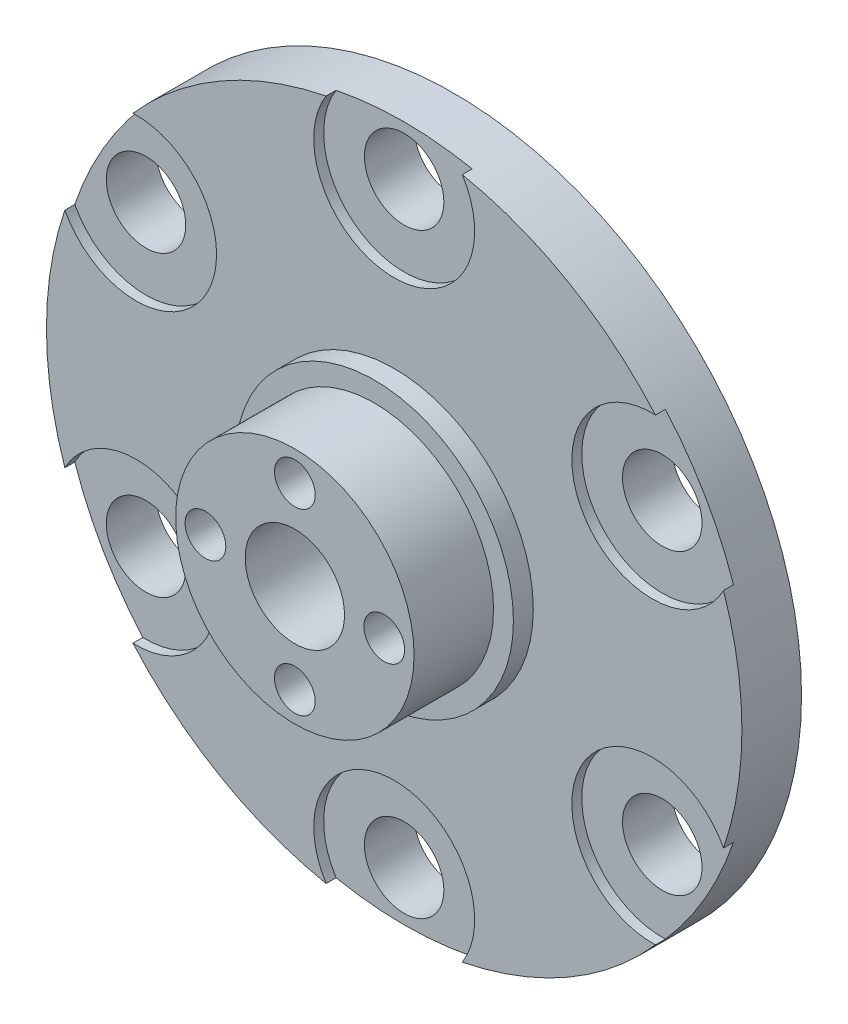
ISO-10303-21;
HEADER;
FILE_DESCRIPTION(('STEP AP214'),'2;1');
FILE_NAME('part.step','',(''),(''),'','','');
FILE_SCHEMA(('AUTOMOTIVE_DESIGN { 1 0 10303 214 1 1 1 1 }'));
ENDSEC;
DATA;
#1=APPLICATION_CONTEXT('core data for automotive mechanical design processes');
#2=APPLICATION_PROTOCOL_DEFINITION('international standard','automotive_design',2000,#1);
#3=PRODUCT_CONTEXT('',#1,'mechanical');
#4=PRODUCT('Part','Part','',(#3));
#5=PRODUCT_RELATED_PRODUCT_CATEGORY('part','',(#4));
#6=PRODUCT_DEFINITION_FORMATION('','',#4);
#7=PRODUCT_DEFINITION_CONTEXT('part definition',#1,'design');
#8=PRODUCT_DEFINITION('design','',#6,#7);
#9=PRODUCT_DEFINITION_SHAPE('','',#8);
#10=(LENGTH_UNIT() NAMED_UNIT(*) SI_UNIT(.MILLI.,.METRE.));
#11=(NAMED_UNIT(*) PLANE_ANGLE_UNIT() SI_UNIT($,.RADIAN.));
#12=(NAMED_UNIT(*) SI_UNIT($,.STERADIAN.) SOLID_ANGLE_UNIT());
#13=UNCERTAINTY_MEASURE_WITH_UNIT(LENGTH_MEASURE(1.E-05),#10,'distance_accuracy_value','');
#14=(GEOMETRIC_REPRESENTATION_CONTEXT(3) GLOBAL_UNCERTAINTY_ASSIGNED_CONTEXT((#13)) GLOBAL_UNIT_ASSIGNED_CONTEXT((#10,
#11,#12)) REPRESENTATION_CONTEXT('',''));
#15=CARTESIAN_POINT('',(0.,0.,0.));
#16=DIRECTION('',(0.,0.,1.));
#17=DIRECTION('',(1.,0.,0.));
#18=AXIS2_PLACEMENT_3D('',#15,#16,#17);
#19=CARTESIAN_POINT('',(0.,15.,3.));
#20=DIRECTION('',(0.,0.,-1.));
#21=DIRECTION('',(-1.,0.,0.));
#22=AXIS2_PLACEMENT_3D('',#19,#20,#21);
#23=CYLINDRICAL_SURFACE('',#22,2.);
#24=CARTESIAN_POINT('',(0.,15.,0.));
#25=DIRECTION('',(0.,0.,1.));
#26=DIRECTION('',(1.,0.,0.));
#27=AXIS2_PLACEMENT_3D('',#24,#25,#26);
#28=CIRCLE('',#27,2.);
#29=CARTESIAN_POINT('',(2.,15.,0.));
#30=VERTEX_POINT('',#29);
#31=EDGE_CURVE('E272',#30,#30,#28,.T.);
#32=ORIENTED_EDGE('',*,*,#31,.F.);
#33=EDGE_LOOP('',(#32));
#34=FACE_BOUND('',#33,.T.);
#35=CARTESIAN_POINT('',(0.,15.,2.5));
#36=DIRECTION('',(0.,0.,1.));
#37=DIRECTION('',(1.,0.,0.));
#38=AXIS2_PLACEMENT_3D('',#35,#36,#37);
#39=CIRCLE('',#38,2.);
#40=CARTESIAN_POINT('',(2.,15.,2.5));
#41=VERTEX_POINT('',#40);
#42=EDGE_CURVE('E195',#41,#41,#39,.T.);
#43=ORIENTED_EDGE('',*,*,#42,.T.);
#44=EDGE_LOOP('',(#43));
#45=FACE_BOUND('',#44,.T.);
#46=ADVANCED_FACE('F41',(#34,#45),#23,.F.);
#47=CARTESIAN_POINT('',(12.9903810567666,7.49999999999997,3.));
#48=DIRECTION('',(0.,0.,-1.));
#49=DIRECTION('',(-1.,0.,0.));
#50=AXIS2_PLACEMENT_3D('',#47,#48,#49);
#51=CYLINDRICAL_SURFACE('',#50,2.);
#52=CARTESIAN_POINT('',(12.9903810567666,7.49999999999997,0.));
#53=DIRECTION('',(0.,0.,1.));
#54=DIRECTION('',(1.,0.,0.));
#55=AXIS2_PLACEMENT_3D('',#52,#53,#54);
#56=CIRCLE('',#55,2.);
#57=CARTESIAN_POINT('',(14.9903810567666,7.49999999999997,0.));
#58=VERTEX_POINT('',#57);
#59=EDGE_CURVE('E270',#58,#58,#56,.T.);
#60=ORIENTED_EDGE('',*,*,#59,.F.);
#61=EDGE_LOOP('',(#60));
#62=FACE_BOUND('',#61,.T.);
#63=CARTESIAN_POINT('',(12.9903810567666,7.49999999999997,2.5));
#64=DIRECTION('',(0.,0.,1.));
#65=DIRECTION('',(1.,0.,0.));
#66=AXIS2_PLACEMENT_3D('',#63,#64,#65);
#67=CIRCLE('',#66,2.);
#68=CARTESIAN_POINT('',(14.9903810567666,7.49999999999997,2.5));
#69=VERTEX_POINT('',#68);
#70=EDGE_CURVE('E191',#69,#69,#67,.T.);
#71=ORIENTED_EDGE('',*,*,#70,.T.);
#72=EDGE_LOOP('',(#71));
#73=FACE_BOUND('',#72,.T.);
#74=ADVANCED_FACE('F303',(#62,#73),#51,.F.);
#75=CARTESIAN_POINT('',(12.9903810567665,-7.50000000000006,3.));
#76=DIRECTION('',(0.,0.,-1.));
#77=DIRECTION('',(-1.,0.,0.));
#78=AXIS2_PLACEMENT_3D('',#75,#76,#77);
#79=CYLINDRICAL_SURFACE('',#78,2.);
#80=CARTESIAN_POINT('',(12.9903810567665,-7.50000000000006,0.));
#81=DIRECTION('',(0.,0.,1.));
#82=DIRECTION('',(1.,0.,0.));
#83=AXIS2_PLACEMENT_3D('',#80,#81,#82);
#84=CIRCLE('',#83,2.);
#85=CARTESIAN_POINT('',(14.9903810567665,-7.50000000000006,0.));
#86=VERTEX_POINT('',#85);
#87=EDGE_CURVE('E267',#86,#86,#84,.T.);
#88=ORIENTED_EDGE('',*,*,#87,.F.);
#89=EDGE_LOOP('',(#88));
#90=FACE_BOUND('',#89,.T.);
#91=CARTESIAN_POINT('',(12.9903810567665,-7.50000000000006,2.5));
#92=DIRECTION('',(0.,0.,1.));
#93=DIRECTION('',(1.,0.,0.));
#94=AXIS2_PLACEMENT_3D('',#91,#92,#93);
#95=CIRCLE('',#94,2.);
#96=CARTESIAN_POINT('',(14.9903810567665,-7.50000000000006,2.5));
#97=VERTEX_POINT('',#96);
#98=EDGE_CURVE('E187',#97,#97,#95,.T.);
#99=ORIENTED_EDGE('',*,*,#98,.T.);
#100=EDGE_LOOP('',(#99));
#101=FACE_BOUND('',#100,.T.);
#102=ADVANCED_FACE('F309',(#90,#101),#79,.F.);
#103=CARTESIAN_POINT('',(-1.04744440165294E-13,-15.,3.));
#104=DIRECTION('',(0.,0.,-1.));
#105=DIRECTION('',(-1.,0.,0.));
#106=AXIS2_PLACEMENT_3D('',#103,#104,#105);
#107=CYLINDRICAL_SURFACE('',#106,2.);
#108=CARTESIAN_POINT('',(-1.04744440165294E-13,-15.,0.));
#109=DIRECTION('',(0.,0.,1.));
#110=DIRECTION('',(1.,0.,0.));
#111=AXIS2_PLACEMENT_3D('',#108,#109,#110);
#112=CIRCLE('',#111,2.);
#113=CARTESIAN_POINT('',(1.9999999999999,-15.,0.));
#114=VERTEX_POINT('',#113);
#115=EDGE_CURVE('E264',#114,#114,#112,.T.);
#116=ORIENTED_EDGE('',*,*,#115,.F.);
#117=EDGE_LOOP('',(#116));
#118=FACE_BOUND('',#117,.T.);
#119=CARTESIAN_POINT('',(-1.04744440165294E-13,-15.,2.5));
#120=DIRECTION('',(0.,0.,1.));
#121=DIRECTION('',(1.,0.,0.));
#122=AXIS2_PLACEMENT_3D('',#119,#120,#121);
#123=CIRCLE('',#122,2.);
#124=CARTESIAN_POINT('',(1.9999999999999,-15.,2.5));
#125=VERTEX_POINT('',#124);
#126=EDGE_CURVE('E183',#125,#125,#123,.T.);
#127=ORIENTED_EDGE('',*,*,#126,.T.);
#128=EDGE_LOOP('',(#127));
#129=FACE_BOUND('',#128,.T.);
#130=ADVANCED_FACE('F628',(#118,#129),#107,.F.);
#131=CARTESIAN_POINT('',(-12.9903810567667,-7.49999999999988,3.));
#132=DIRECTION('',(0.,0.,-1.));
#133=DIRECTION('',(-1.,0.,0.));
#134=AXIS2_PLACEMENT_3D('',#131,#132,#133);
#135=CYLINDRICAL_SURFACE('',#134,2.);
#136=CARTESIAN_POINT('',(-12.9903810567667,-7.49999999999988,0.));
#137=DIRECTION('',(0.,0.,1.));
#138=DIRECTION('',(1.,0.,0.));
#139=AXIS2_PLACEMENT_3D('',#136,#137,#138);
#140=CIRCLE('',#139,2.);
#141=CARTESIAN_POINT('',(-10.9903810567667,-7.49999999999988,0.));
#142=VERTEX_POINT('',#141);
#143=EDGE_CURVE('E261',#142,#142,#140,.T.);
#144=ORIENTED_EDGE('',*,*,#143,.F.);
#145=EDGE_LOOP('',(#144));
#146=FACE_BOUND('',#145,.T.);
#147=CARTESIAN_POINT('',(-12.9903810567667,-7.49999999999988,2.5));
#148=DIRECTION('',(0.,0.,1.));
#149=DIRECTION('',(1.,0.,0.));
#150=AXIS2_PLACEMENT_3D('',#147,#148,#149);
#151=CIRCLE('',#150,2.);
#152=CARTESIAN_POINT('',(-10.9903810567667,-7.49999999999988,2.5));
#153=VERTEX_POINT('',#152);
#154=EDGE_CURVE('E179',#153,#153,#151,.T.);
#155=ORIENTED_EDGE('',*,*,#154,.T.);
#156=EDGE_LOOP('',(#155));
#157=FACE_BOUND('',#156,.T.);
#158=ADVANCED_FACE('F620',(#146,#157),#135,.F.);
#159=CARTESIAN_POINT('',(-12.9903810567665,7.50000000000015,3.));
#160=DIRECTION('',(0.,0.,-1.));
#161=DIRECTION('',(-1.,0.,0.));
#162=AXIS2_PLACEMENT_3D('',#159,#160,#161);
#163=CYLINDRICAL_SURFACE('',#162,2.);
#164=CARTESIAN_POINT('',(-12.9903810567665,7.50000000000015,0.));
#165=DIRECTION('',(0.,0.,1.));
#166=DIRECTION('',(1.,0.,0.));
#167=AXIS2_PLACEMENT_3D('',#164,#165,#166);
#168=CIRCLE('',#167,2.);
#169=CARTESIAN_POINT('',(-10.9903810567665,7.50000000000015,0.));
#170=VERTEX_POINT('',#169);
#171=EDGE_CURVE('E258',#170,#170,#168,.T.);
#172=ORIENTED_EDGE('',*,*,#171,.F.);
#173=EDGE_LOOP('',(#172));
#174=FACE_BOUND('',#173,.T.);
#175=CARTESIAN_POINT('',(-12.9903810567665,7.50000000000015,2.5));
#176=DIRECTION('',(0.,0.,1.));
#177=DIRECTION('',(1.,0.,0.));
#178=AXIS2_PLACEMENT_3D('',#175,#176,#177);
#179=CIRCLE('',#178,2.);
#180=CARTESIAN_POINT('',(-10.9903810567665,7.50000000000015,2.5));
#181=VERTEX_POINT('',#180);
#182=EDGE_CURVE('E175',#181,#181,#179,.T.);
#183=ORIENTED_EDGE('',*,*,#182,.T.);
#184=EDGE_LOOP('',(#183));
#185=FACE_BOUND('',#184,.T.);
#186=ADVANCED_FACE('F316',(#174,#185),#163,.F.);
#187=CARTESIAN_POINT('',(0.,0.,3.));
#188=DIRECTION('',(0.,0.,1.));
#189=DIRECTION('',(1.,0.,0.));
#190=AXIS2_PLACEMENT_3D('',#187,#188,#189);
#191=PLANE('',#190);
#192=CARTESIAN_POINT('',(0.,0.,3.));
#193=DIRECTION('',(0.,0.,1.));
#194=DIRECTION('',(1.,0.,0.));
#195=AXIS2_PLACEMENT_3D('',#192,#193,#194);
#196=CIRCLE('',#195,7.);
#197=CARTESIAN_POINT('',(7.,0.,3.));
#198=VERTEX_POINT('',#197);
#199=EDGE_CURVE('E543',#198,#198,#196,.T.);
#200=ORIENTED_EDGE('',*,*,#199,.F.);
#201=EDGE_LOOP('',(#200));
#202=FACE_BOUND('',#201,.T.);
#203=CARTESIAN_POINT('',(12.9903810567665,-7.50000000000006,3.));
#204=DIRECTION('',(0.,0.,1.));
#205=DIRECTION('',(1.,0.,0.));
#206=AXIS2_PLACEMENT_3D('',#203,#204,#205);
#207=CIRCLE('',#206,4.05);
#208=CARTESIAN_POINT('',(16.5748257114647,-5.61472640781089,3.));
#209=VERTEX_POINT('',#208);
#210=CARTESIAN_POINT('',(13.1499085601958,-11.5468569255226,3.));
#211=VERTEX_POINT('',#210);
#212=EDGE_CURVE('E225',#209,#211,#207,.T.);
#213=ORIENTED_EDGE('',*,*,#212,.F.);
#214=CARTESIAN_POINT('',(0.,0.,3.));
#215=DIRECTION('',(0.,0.,1.));
#216=DIRECTION('',(1.,0.,0.));
#217=AXIS2_PLACEMENT_3D('',#214,#215,#216);
#218=CIRCLE('',#217,17.5);
#219=CARTESIAN_POINT('',(16.5748257114647,5.61472640781078,3.));
#220=VERTEX_POINT('',#219);
#221=EDGE_CURVE('E164',#209,#220,#218,.T.);
#222=ORIENTED_EDGE('',*,*,#221,.T.);
#223=CARTESIAN_POINT('',(12.9903810567666,7.49999999999997,3.));
#224=DIRECTION('',(0.,0.,1.));
#225=DIRECTION('',(1.,0.,0.));
#226=AXIS2_PLACEMENT_3D('',#223,#224,#225);
#227=CIRCLE('',#226,4.05);
#228=CARTESIAN_POINT('',(13.1499085601959,11.5468569255225,3.));
#229=VERTEX_POINT('',#228);
#230=EDGE_CURVE('E230',#229,#220,#227,.T.);
#231=ORIENTED_EDGE('',*,*,#230,.F.);
#232=CARTESIAN_POINT('',(3.42491715126909,17.1615833333333,3.));
#233=VERTEX_POINT('',#232);
#234=EDGE_CURVE('E160',#229,#233,#218,.T.);
#235=ORIENTED_EDGE('',*,*,#234,.T.);
#236=CARTESIAN_POINT('',(2.08166817117217E-13,15.,3.));
#237=DIRECTION('',(0.,0.,1.));
#238=DIRECTION('',(1.,0.,0.));
#239=AXIS2_PLACEMENT_3D('',#236,#237,#238);
#240=CIRCLE('',#239,4.05);
#241=CARTESIAN_POINT('',(-3.42491715126861,17.1615833333334,3.));
#242=VERTEX_POINT('',#241);
#243=EDGE_CURVE('E159',#242,#233,#240,.T.);
#244=ORIENTED_EDGE('',*,*,#243,.F.);
#245=CARTESIAN_POINT('',(-13.1499085601957,11.5468569255227,3.));
#246=VERTEX_POINT('',#245);
#247=EDGE_CURVE('E151',#242,#246,#218,.T.);
#248=ORIENTED_EDGE('',*,*,#247,.T.);
#249=CARTESIAN_POINT('',(-12.9903810567665,7.50000000000015,3.));
#250=DIRECTION('',(0.,0.,1.));
#251=DIRECTION('',(1.,0.,0.));
#252=AXIS2_PLACEMENT_3D('',#249,#250,#251);
#253=CIRCLE('',#252,4.05);
#254=CARTESIAN_POINT('',(-16.5748257114647,5.61472640781101,3.));
#255=VERTEX_POINT('',#254);
#256=EDGE_CURVE('E131',#255,#246,#253,.T.);
#257=ORIENTED_EDGE('',*,*,#256,.F.);
#258=CARTESIAN_POINT('',(-16.5748257114648,-5.61472640781066,3.));
#259=VERTEX_POINT('',#258);
#260=EDGE_CURVE('E161',#255,#259,#218,.T.);
#261=ORIENTED_EDGE('',*,*,#260,.T.);
#262=CARTESIAN_POINT('',(-12.9903810567666,-7.49999999999988,3.));
#263=DIRECTION('',(0.,0.,1.));
#264=DIRECTION('',(1.,0.,0.));
#265=AXIS2_PLACEMENT_3D('',#262,#263,#264);
#266=CIRCLE('',#265,4.05);
#267=CARTESIAN_POINT('',(-13.149908560196,-11.5468569255224,3.));
#268=VERTEX_POINT('',#267);
#269=EDGE_CURVE('E241',#268,#259,#266,.T.);
#270=ORIENTED_EDGE('',*,*,#269,.F.);
#271=CARTESIAN_POINT('',(-3.42491715126897,-17.1615833333333,3.));
#272=VERTEX_POINT('',#271);
#273=EDGE_CURVE('E165',#268,#272,#218,.T.);
#274=ORIENTED_EDGE('',*,*,#273,.T.);
#275=CARTESIAN_POINT('',(-1.04950770296597E-13,-15.,3.));
#276=DIRECTION('',(0.,0.,1.));
#277=DIRECTION('',(1.,0.,0.));
#278=AXIS2_PLACEMENT_3D('',#275,#276,#277);
#279=CIRCLE('',#278,4.05);
#280=CARTESIAN_POINT('',(3.42491715126873,-17.1615833333334,3.));
#281=VERTEX_POINT('',#280);
#282=EDGE_CURVE('E233',#281,#272,#279,.T.);
#283=ORIENTED_EDGE('',*,*,#282,.F.);
#284=EDGE_CURVE('E169',#281,#211,#218,.T.);
#285=ORIENTED_EDGE('',*,*,#284,.T.);
#286=EDGE_LOOP('',(#213,#222,#231,#235,#244,#248,#257,#261,#270,#274,#283,#285));
#287=FACE_BOUND('',#286,.T.);
#288=ADVANCED_FACE('F157',(#202,#287),#191,.T.);
#289=CARTESIAN_POINT('',(0.,0.,0.));
#290=DIRECTION('',(0.,0.,1.));
#291=DIRECTION('',(1.,0.,0.));
#292=AXIS2_PLACEMENT_3D('',#289,#290,#291);
#293=PLANE('',#292);
#294=CARTESIAN_POINT('',(0.,0.,0.));
#295=DIRECTION('',(0.,0.,1.));
#296=DIRECTION('',(1.,0.,0.));
#297=AXIS2_PLACEMENT_3D('',#294,#295,#296);
#298=CIRCLE('',#297,17.5);
#299=CARTESIAN_POINT('',(17.5,0.,0.));
#300=VERTEX_POINT('',#299);
#301=EDGE_CURVE('E170',#300,#300,#298,.T.);
#302=ORIENTED_EDGE('',*,*,#301,.F.);
#303=EDGE_LOOP('',(#302));
#304=FACE_BOUND('',#303,.T.);
#305=CARTESIAN_POINT('',(0.,0.,0.));
#306=DIRECTION('',(0.,0.,1.));
#307=DIRECTION('',(1.,0.,0.));
#308=AXIS2_PLACEMENT_3D('',#305,#306,#307);
#309=CIRCLE('',#308,2.5);
#310=CARTESIAN_POINT('',(2.5,0.,0.));
#311=VERTEX_POINT('',#310);
#312=EDGE_CURVE('E171',#311,#311,#309,.T.);
#313=ORIENTED_EDGE('',*,*,#312,.T.);
#314=EDGE_LOOP('',(#313));
#315=FACE_BOUND('',#314,.T.);
#316=ORIENTED_EDGE('',*,*,#31,.T.);
#317=EDGE_LOOP('',(#316));
#318=FACE_BOUND('',#317,.T.);
#319=ORIENTED_EDGE('',*,*,#59,.T.);
#320=EDGE_LOOP('',(#319));
#321=FACE_BOUND('',#320,.T.);
#322=ORIENTED_EDGE('',*,*,#87,.T.);
#323=EDGE_LOOP('',(#322));
#324=FACE_BOUND('',#323,.T.);
#325=ORIENTED_EDGE('',*,*,#115,.T.);
#326=EDGE_LOOP('',(#325));
#327=FACE_BOUND('',#326,.T.);
#328=ORIENTED_EDGE('',*,*,#143,.T.);
#329=EDGE_LOOP('',(#328));
#330=FACE_BOUND('',#329,.T.);
#331=ORIENTED_EDGE('',*,*,#171,.T.);
#332=EDGE_LOOP('',(#331));
#333=FACE_BOUND('',#332,.T.);
#334=ADVANCED_FACE('F279',(#304,#315,#318,#321,#324,#327,#330,#333),#293,.F.);
#335=CARTESIAN_POINT('',(0.,0.,3.));
#336=DIRECTION('',(0.,0.,-1.));
#337=DIRECTION('',(-1.,0.,0.));
#338=AXIS2_PLACEMENT_3D('',#335,#336,#337);
#339=CYLINDRICAL_SURFACE('',#338,17.5);
#340=CARTESIAN_POINT('',(0.,0.,2.5));
#341=DIRECTION('',(0.,0.,1.));
#342=DIRECTION('',(1.,0.,0.));
#343=AXIS2_PLACEMENT_3D('',#340,#341,#342);
#344=CIRCLE('',#343,17.5);
#345=CARTESIAN_POINT('',(13.1499085601958,-11.5468569255226,2.5));
#346=VERTEX_POINT('',#345);
#347=CARTESIAN_POINT('',(16.5748257114647,-5.61472640781089,2.5));
#348=VERTEX_POINT('',#347);
#349=EDGE_CURVE('E190',#346,#348,#344,.T.);
#350=ORIENTED_EDGE('',*,*,#349,.F.);
#351=DIRECTION('',(0.,0.,1.));
#352=VECTOR('',#351,1.);
#353=CARTESIAN_POINT('',(13.1499085601958,-11.5468569255226,2.75));
#354=LINE('',#353,#352);
#355=EDGE_CURVE('E11',#346,#211,#354,.T.);
#356=ORIENTED_EDGE('',*,*,#355,.T.);
#357=ORIENTED_EDGE('',*,*,#284,.F.);
#358=DIRECTION('',(0.,0.,1.));
#359=VECTOR('',#358,1.);
#360=CARTESIAN_POINT('',(3.42491715126873,-17.1615833333334,2.75));
#361=LINE('',#360,#359);
#362=CARTESIAN_POINT('',(3.42491715126873,-17.1615833333334,2.5));
#363=VERTEX_POINT('',#362);
#364=EDGE_CURVE('E215',#281,#363,#361,.F.);
#365=ORIENTED_EDGE('',*,*,#364,.T.);
#366=CARTESIAN_POINT('',(0.,0.,2.5));
#367=DIRECTION('',(0.,0.,1.));
#368=DIRECTION('',(1.,0.,0.));
#369=AXIS2_PLACEMENT_3D('',#366,#367,#368);
#370=CIRCLE('',#369,17.5);
#371=CARTESIAN_POINT('',(-3.42491715126897,-17.1615833333333,2.5));
#372=VERTEX_POINT('',#371);
#373=EDGE_CURVE('E186',#372,#363,#370,.T.);
#374=ORIENTED_EDGE('',*,*,#373,.F.);
#375=DIRECTION('',(0.,0.,1.));
#376=VECTOR('',#375,1.);
#377=CARTESIAN_POINT('',(-3.42491715126897,-17.1615833333333,2.75));
#378=LINE('',#377,#376);
#379=EDGE_CURVE('E218',#372,#272,#378,.T.);
#380=ORIENTED_EDGE('',*,*,#379,.T.);
#381=ORIENTED_EDGE('',*,*,#273,.F.);
#382=DIRECTION('',(0.,0.,1.));
#383=VECTOR('',#382,1.);
#384=CARTESIAN_POINT('',(-13.149908560196,-11.5468569255224,2.75));
#385=LINE('',#384,#383);
#386=CARTESIAN_POINT('',(-13.149908560196,-11.5468569255224,2.5));
#387=VERTEX_POINT('',#386);
#388=EDGE_CURVE('E153',#268,#387,#385,.F.);
#389=ORIENTED_EDGE('',*,*,#388,.T.);
#390=CARTESIAN_POINT('',(0.,0.,2.5));
#391=DIRECTION('',(0.,0.,1.));
#392=DIRECTION('',(1.,0.,0.));
#393=AXIS2_PLACEMENT_3D('',#390,#391,#392);
#394=CIRCLE('',#393,17.5);
#395=CARTESIAN_POINT('',(-16.5748257114648,-5.61472640781066,2.5));
#396=VERTEX_POINT('',#395);
#397=EDGE_CURVE('E182',#396,#387,#394,.T.);
#398=ORIENTED_EDGE('',*,*,#397,.F.);
#399=DIRECTION('',(0.,0.,1.));
#400=VECTOR('',#399,1.);
#401=CARTESIAN_POINT('',(-16.5748257114648,-5.61472640781067,2.75));
#402=LINE('',#401,#400);
#403=EDGE_CURVE('E212',#396,#259,#402,.T.);
#404=ORIENTED_EDGE('',*,*,#403,.T.);
#405=ORIENTED_EDGE('',*,*,#260,.F.);
#406=DIRECTION('',(0.,0.,1.));
#407=VECTOR('',#406,1.);
#408=CARTESIAN_POINT('',(-16.5748257114647,5.61472640781101,2.75));
#409=LINE('',#408,#407);
#410=CARTESIAN_POINT('',(-16.5748257114647,5.61472640781101,2.5));
#411=VERTEX_POINT('',#410);
#412=EDGE_CURVE('E138',#255,#411,#409,.F.);
#413=ORIENTED_EDGE('',*,*,#412,.T.);
#414=CARTESIAN_POINT('',(0.,0.,2.5));
#415=DIRECTION('',(0.,0.,1.));
#416=DIRECTION('',(1.,0.,0.));
#417=AXIS2_PLACEMENT_3D('',#414,#415,#416);
#418=CIRCLE('',#417,17.5);
#419=CARTESIAN_POINT('',(-13.1499085601957,11.5468569255227,2.5));
#420=VERTEX_POINT('',#419);
#421=EDGE_CURVE('E152',#420,#411,#418,.T.);
#422=ORIENTED_EDGE('',*,*,#421,.F.);
#423=DIRECTION('',(0.,0.,1.));
#424=VECTOR('',#423,1.);
#425=CARTESIAN_POINT('',(-13.1499085601957,11.5468569255227,2.75));
#426=LINE('',#425,#424);
#427=EDGE_CURVE('E135',#420,#246,#426,.T.);
#428=ORIENTED_EDGE('',*,*,#427,.T.);
#429=ORIENTED_EDGE('',*,*,#247,.F.);
#430=DIRECTION('',(0.,0.,1.));
#431=VECTOR('',#430,1.);
#432=CARTESIAN_POINT('',(-3.42491715126861,17.1615833333334,2.75));
#433=LINE('',#432,#431);
#434=CARTESIAN_POINT('',(-3.42491715126861,17.1615833333334,2.5));
#435=VERTEX_POINT('',#434);
#436=EDGE_CURVE('E204',#242,#435,#433,.F.);
#437=ORIENTED_EDGE('',*,*,#436,.T.);
#438=CARTESIAN_POINT('',(0.,0.,2.5));
#439=DIRECTION('',(0.,0.,1.));
#440=DIRECTION('',(1.,0.,0.));
#441=AXIS2_PLACEMENT_3D('',#438,#439,#440);
#442=CIRCLE('',#441,17.5);
#443=CARTESIAN_POINT('',(3.42491715126909,17.1615833333333,2.5));
#444=VERTEX_POINT('',#443);
#445=EDGE_CURVE('E198',#444,#435,#442,.T.);
#446=ORIENTED_EDGE('',*,*,#445,.F.);
#447=DIRECTION('',(0.,0.,1.));
#448=VECTOR('',#447,1.);
#449=CARTESIAN_POINT('',(3.42491715126909,17.1615833333333,2.75));
#450=LINE('',#449,#448);
#451=EDGE_CURVE('E206',#444,#233,#450,.T.);
#452=ORIENTED_EDGE('',*,*,#451,.T.);
#453=ORIENTED_EDGE('',*,*,#234,.F.);
#454=DIRECTION('',(0.,0.,1.));
#455=VECTOR('',#454,1.);
#456=CARTESIAN_POINT('',(13.1499085601959,11.5468569255225,2.75));
#457=LINE('',#456,#455);
#458=CARTESIAN_POINT('',(13.1499085601959,11.5468569255225,2.5));
#459=VERTEX_POINT('',#458);
#460=EDGE_CURVE('E163',#229,#459,#457,.F.);
#461=ORIENTED_EDGE('',*,*,#460,.T.);
#462=CARTESIAN_POINT('',(0.,0.,2.5));
#463=DIRECTION('',(0.,0.,1.));
#464=DIRECTION('',(1.,0.,0.));
#465=AXIS2_PLACEMENT_3D('',#462,#463,#464);
#466=CIRCLE('',#465,17.5);
#467=CARTESIAN_POINT('',(16.5748257114647,5.61472640781078,2.5));
#468=VERTEX_POINT('',#467);
#469=EDGE_CURVE('E194',#468,#459,#466,.T.);
#470=ORIENTED_EDGE('',*,*,#469,.F.);
#471=DIRECTION('',(0.,0.,1.));
#472=VECTOR('',#471,1.);
#473=CARTESIAN_POINT('',(16.5748257114647,5.61472640781078,2.75));
#474=LINE('',#473,#472);
#475=EDGE_CURVE('E201',#468,#220,#474,.T.);
#476=ORIENTED_EDGE('',*,*,#475,.T.);
#477=ORIENTED_EDGE('',*,*,#221,.F.);
#478=DIRECTION('',(0.,0.,1.));
#479=VECTOR('',#478,1.);
#480=CARTESIAN_POINT('',(16.5748257114647,-5.6147264078109,2.75));
#481=LINE('',#480,#479);
#482=EDGE_CURVE('E50',#209,#348,#481,.F.);
#483=ORIENTED_EDGE('',*,*,#482,.T.);
#484=EDGE_LOOP('',(#350,#356,#357,#365,#374,#380,#381,#389,#398,#404,#405,#413,#422,#428,#429,
#437,#446,#452,#453,#461,#470,#476,#477,#483));
#485=FACE_BOUND('',#484,.T.);
#486=ORIENTED_EDGE('',*,*,#301,.T.);
#487=EDGE_LOOP('',(#486));
#488=FACE_BOUND('',#487,.T.);
#489=ADVANCED_FACE('F43',(#485,#488),#339,.T.);
#490=CARTESIAN_POINT('',(0.,0.,3.));
#491=DIRECTION('',(0.,0.,-1.));
#492=DIRECTION('',(-1.,0.,0.));
#493=AXIS2_PLACEMENT_3D('',#490,#491,#492);
#494=CYLINDRICAL_SURFACE('',#493,2.5);
#495=ORIENTED_EDGE('',*,*,#312,.F.);
#496=EDGE_LOOP('',(#495));
#497=FACE_BOUND('',#496,.T.);
#498=CARTESIAN_POINT('',(0.,0.,8.));
#499=DIRECTION('',(0.,0.,1.));
#500=DIRECTION('',(1.,0.,0.));
#501=AXIS2_PLACEMENT_3D('',#498,#499,#500);
#502=CIRCLE('',#501,2.5);
#503=CARTESIAN_POINT('',(2.5,0.,8.));
#504=VERTEX_POINT('',#503);
#505=EDGE_CURVE('E252',#504,#504,#502,.T.);
#506=ORIENTED_EDGE('',*,*,#505,.T.);
#507=EDGE_LOOP('',(#506));
#508=FACE_BOUND('',#507,.T.);
#509=ADVANCED_FACE('F281',(#497,#508),#494,.F.);
#510=CARTESIAN_POINT('',(0.,0.,8.));
#511=DIRECTION('',(0.,0.,1.));
#512=DIRECTION('',(1.,0.,0.));
#513=AXIS2_PLACEMENT_3D('',#510,#511,#512);
#514=PLANE('',#513);
#515=CARTESIAN_POINT('',(0.,4.5,8.));
#516=DIRECTION('',(0.,0.,1.));
#517=DIRECTION('',(1.,0.,0.));
#518=AXIS2_PLACEMENT_3D('',#515,#516,#517);
#519=CIRCLE('',#518,1.025);
#520=CARTESIAN_POINT('',(1.025,4.5,8.));
#521=VERTEX_POINT('',#520);
#522=EDGE_CURVE('E550',#521,#521,#519,.T.);
#523=ORIENTED_EDGE('',*,*,#522,.F.);
#524=EDGE_LOOP('',(#523));
#525=FACE_BOUND('',#524,.T.);
#526=CARTESIAN_POINT('',(4.5,0.,8.));
#527=DIRECTION('',(0.,0.,1.));
#528=DIRECTION('',(1.,0.,0.));
#529=AXIS2_PLACEMENT_3D('',#526,#527,#528);
#530=CIRCLE('',#529,1.025);
#531=CARTESIAN_POINT('',(5.525,0.,8.));
#532=VERTEX_POINT('',#531);
#533=EDGE_CURVE('E553',#532,#532,#530,.T.);
#534=ORIENTED_EDGE('',*,*,#533,.F.);
#535=EDGE_LOOP('',(#534));
#536=FACE_BOUND('',#535,.T.);
#537=CARTESIAN_POINT('',(0.,-4.5,8.));
#538=DIRECTION('',(0.,0.,1.));
#539=DIRECTION('',(1.,0.,0.));
#540=AXIS2_PLACEMENT_3D('',#537,#538,#539);
#541=CIRCLE('',#540,1.025);
#542=CARTESIAN_POINT('',(1.025,-4.5,8.));
#543=VERTEX_POINT('',#542);
#544=EDGE_CURVE('E559',#543,#543,#541,.T.);
#545=ORIENTED_EDGE('',*,*,#544,.F.);
#546=EDGE_LOOP('',(#545));
#547=FACE_BOUND('',#546,.T.);
#548=CARTESIAN_POINT('',(-4.5,0.,8.));
#549=DIRECTION('',(0.,0.,1.));
#550=DIRECTION('',(1.,0.,0.));
#551=AXIS2_PLACEMENT_3D('',#548,#549,#550);
#552=CIRCLE('',#551,1.025);
#553=CARTESIAN_POINT('',(-3.475,0.,8.));
#554=VERTEX_POINT('',#553);
#555=EDGE_CURVE('E565',#554,#554,#552,.T.);
#556=ORIENTED_EDGE('',*,*,#555,.F.);
#557=EDGE_LOOP('',(#556));
#558=FACE_BOUND('',#557,.T.);
#559=CARTESIAN_POINT('',(0.,0.,8.));
#560=DIRECTION('',(0.,0.,1.));
#561=DIRECTION('',(1.,0.,0.));
#562=AXIS2_PLACEMENT_3D('',#559,#560,#561);
#563=CIRCLE('',#562,6.);
#564=CARTESIAN_POINT('',(6.,0.,8.));
#565=VERTEX_POINT('',#564);
#566=EDGE_CURVE('E255',#565,#565,#563,.T.);
#567=ORIENTED_EDGE('',*,*,#566,.T.);
#568=EDGE_LOOP('',(#567));
#569=FACE_BOUND('',#568,.T.);
#570=ORIENTED_EDGE('',*,*,#505,.F.);
#571=EDGE_LOOP('',(#570));
#572=FACE_BOUND('',#571,.T.);
#573=ADVANCED_FACE('F284',(#525,#536,#547,#558,#569,#572),#514,.T.);
#574=CARTESIAN_POINT('',(0.,0.,8.));
#575=DIRECTION('',(0.,0.,-1.));
#576=DIRECTION('',(-1.,0.,0.));
#577=AXIS2_PLACEMENT_3D('',#574,#575,#576);
#578=CYLINDRICAL_SURFACE('',#577,6.);
#579=CARTESIAN_POINT('',(0.,0.,4.));
#580=DIRECTION('',(0.,0.,1.));
#581=DIRECTION('',(1.,0.,0.));
#582=AXIS2_PLACEMENT_3D('',#579,#580,#581);
#583=CIRCLE('',#582,6.);
#584=CARTESIAN_POINT('',(6.,0.,4.));
#585=VERTEX_POINT('',#584);
#586=EDGE_CURVE('E45',#585,#585,#583,.T.);
#587=ORIENTED_EDGE('',*,*,#586,.T.);
#588=EDGE_LOOP('',(#587));
#589=FACE_BOUND('',#588,.T.);
#590=ORIENTED_EDGE('',*,*,#566,.F.);
#591=EDGE_LOOP('',(#590));
#592=FACE_BOUND('',#591,.T.);
#593=ADVANCED_FACE('F289',(#589,#592),#578,.T.);
#594=CARTESIAN_POINT('',(-12.9903810567665,7.50000000000015,2.5));
#595=DIRECTION('',(0.,0.,1.));
#596=DIRECTION('',(1.,0.,0.));
#597=AXIS2_PLACEMENT_3D('',#594,#595,#596);
#598=CYLINDRICAL_SURFACE('',#597,4.05);
#599=CARTESIAN_POINT('',(-12.9903810567665,7.50000000000015,2.5));
#600=DIRECTION('',(0.,0.,1.));
#601=DIRECTION('',(1.,0.,0.));
#602=AXIS2_PLACEMENT_3D('',#599,#600,#601);
#603=CIRCLE('',#602,4.05);
#604=EDGE_CURVE('E144',#411,#420,#603,.T.);
#605=ORIENTED_EDGE('',*,*,#604,.F.);
#606=ORIENTED_EDGE('',*,*,#412,.F.);
#607=ORIENTED_EDGE('',*,*,#256,.T.);
#608=ORIENTED_EDGE('',*,*,#427,.F.);
#609=EDGE_LOOP('',(#605,#606,#607,#608));
#610=FACE_BOUND('',#609,.T.);
#611=ADVANCED_FACE('F134',(#610),#598,.F.);
#612=CARTESIAN_POINT('',(-12.9903810567665,7.50000000000015,2.5));
#613=DIRECTION('',(0.,0.,1.));
#614=DIRECTION('',(1.,0.,0.));
#615=AXIS2_PLACEMENT_3D('',#612,#613,#614);
#616=PLANE('',#615);
#617=ORIENTED_EDGE('',*,*,#182,.F.);
#618=EDGE_LOOP('',(#617));
#619=FACE_BOUND('',#618,.T.);
#620=ORIENTED_EDGE('',*,*,#421,.T.);
#621=ORIENTED_EDGE('',*,*,#604,.T.);
#622=EDGE_LOOP('',(#620,#621));
#623=FACE_BOUND('',#622,.T.);
#624=ADVANCED_FACE('F338',(#619,#623),#616,.T.);
#625=CARTESIAN_POINT('',(-12.9903810567666,-7.49999999999988,2.5));
#626=DIRECTION('',(0.,0.,1.));
#627=DIRECTION('',(1.,0.,0.));
#628=AXIS2_PLACEMENT_3D('',#625,#626,#627);
#629=CYLINDRICAL_SURFACE('',#628,4.05);
#630=CARTESIAN_POINT('',(-12.9903810567666,-7.49999999999988,2.5));
#631=DIRECTION('',(0.,0.,1.));
#632=DIRECTION('',(1.,0.,0.));
#633=AXIS2_PLACEMENT_3D('',#630,#631,#632);
#634=CIRCLE('',#633,4.05);
#635=EDGE_CURVE('E143',#387,#396,#634,.T.);
#636=ORIENTED_EDGE('',*,*,#635,.F.);
#637=ORIENTED_EDGE('',*,*,#388,.F.);
#638=ORIENTED_EDGE('',*,*,#269,.T.);
#639=ORIENTED_EDGE('',*,*,#403,.F.);
#640=EDGE_LOOP('',(#636,#637,#638,#639));
#641=FACE_BOUND('',#640,.T.);
#642=ADVANCED_FACE('F347',(#641),#629,.F.);
#643=CARTESIAN_POINT('',(-12.9903810567666,-7.49999999999988,2.5));
#644=DIRECTION('',(0.,0.,1.));
#645=DIRECTION('',(1.,0.,0.));
#646=AXIS2_PLACEMENT_3D('',#643,#644,#645);
#647=PLANE('',#646);
#648=ORIENTED_EDGE('',*,*,#154,.F.);
#649=EDGE_LOOP('',(#648));
#650=FACE_BOUND('',#649,.T.);
#651=ORIENTED_EDGE('',*,*,#397,.T.);
#652=ORIENTED_EDGE('',*,*,#635,.T.);
#653=EDGE_LOOP('',(#651,#652));
#654=FACE_BOUND('',#653,.T.);
#655=ADVANCED_FACE('F356',(#650,#654),#647,.T.);
#656=CARTESIAN_POINT('',(-1.04950770296597E-13,-15.,2.5));
#657=DIRECTION('',(0.,0.,1.));
#658=DIRECTION('',(1.,0.,0.));
#659=AXIS2_PLACEMENT_3D('',#656,#657,#658);
#660=CYLINDRICAL_SURFACE('',#659,4.05);
#661=CARTESIAN_POINT('',(-1.04950770296597E-13,-15.,2.5));
#662=DIRECTION('',(0.,0.,1.));
#663=DIRECTION('',(1.,0.,0.));
#664=AXIS2_PLACEMENT_3D('',#661,#662,#663);
#665=CIRCLE('',#664,4.05);
#666=EDGE_CURVE('E63',#363,#372,#665,.T.);
#667=ORIENTED_EDGE('',*,*,#666,.F.);
#668=ORIENTED_EDGE('',*,*,#364,.F.);
#669=ORIENTED_EDGE('',*,*,#282,.T.);
#670=ORIENTED_EDGE('',*,*,#379,.F.);
#671=EDGE_LOOP('',(#667,#668,#669,#670));
#672=FACE_BOUND('',#671,.T.);
#673=ADVANCED_FACE('F365',(#672),#660,.F.);
#674=CARTESIAN_POINT('',(-1.04950770296597E-13,-15.,2.5));
#675=DIRECTION('',(0.,0.,1.));
#676=DIRECTION('',(1.,0.,0.));
#677=AXIS2_PLACEMENT_3D('',#674,#675,#676);
#678=PLANE('',#677);
#679=ORIENTED_EDGE('',*,*,#126,.F.);
#680=EDGE_LOOP('',(#679));
#681=FACE_BOUND('',#680,.T.);
#682=ORIENTED_EDGE('',*,*,#373,.T.);
#683=ORIENTED_EDGE('',*,*,#666,.T.);
#684=EDGE_LOOP('',(#682,#683));
#685=FACE_BOUND('',#684,.T.);
#686=ADVANCED_FACE('F374',(#681,#685),#678,.T.);
#687=CARTESIAN_POINT('',(12.9903810567665,-7.50000000000006,2.5));
#688=DIRECTION('',(0.,0.,1.));
#689=DIRECTION('',(1.,0.,0.));
#690=AXIS2_PLACEMENT_3D('',#687,#688,#689);
#691=CYLINDRICAL_SURFACE('',#690,4.05);
#692=CARTESIAN_POINT('',(12.9903810567665,-7.50000000000006,2.5));
#693=DIRECTION('',(0.,0.,1.));
#694=DIRECTION('',(1.,0.,0.));
#695=AXIS2_PLACEMENT_3D('',#692,#693,#694);
#696=CIRCLE('',#695,4.05);
#697=EDGE_CURVE('E56',#348,#346,#696,.T.);
#698=ORIENTED_EDGE('',*,*,#697,.F.);
#699=ORIENTED_EDGE('',*,*,#482,.F.);
#700=ORIENTED_EDGE('',*,*,#212,.T.);
#701=ORIENTED_EDGE('',*,*,#355,.F.);
#702=EDGE_LOOP('',(#698,#699,#700,#701));
#703=FACE_BOUND('',#702,.T.);
#704=ADVANCED_FACE('F224',(#703),#691,.F.);
#705=CARTESIAN_POINT('',(12.9903810567665,-7.50000000000006,2.5));
#706=DIRECTION('',(0.,0.,1.));
#707=DIRECTION('',(1.,0.,0.));
#708=AXIS2_PLACEMENT_3D('',#705,#706,#707);
#709=PLANE('',#708);
#710=ORIENTED_EDGE('',*,*,#98,.F.);
#711=EDGE_LOOP('',(#710));
#712=FACE_BOUND('',#711,.T.);
#713=ORIENTED_EDGE('',*,*,#349,.T.);
#714=ORIENTED_EDGE('',*,*,#697,.T.);
#715=EDGE_LOOP('',(#713,#714));
#716=FACE_BOUND('',#715,.T.);
#717=ADVANCED_FACE('F391',(#712,#716),#709,.T.);
#718=CARTESIAN_POINT('',(12.9903810567666,7.49999999999997,2.5));
#719=DIRECTION('',(0.,0.,1.));
#720=DIRECTION('',(1.,0.,0.));
#721=AXIS2_PLACEMENT_3D('',#718,#719,#720);
#722=CYLINDRICAL_SURFACE('',#721,4.05);
#723=CARTESIAN_POINT('',(12.9903810567666,7.49999999999997,2.5));
#724=DIRECTION('',(0.,0.,1.));
#725=DIRECTION('',(1.,0.,0.));
#726=AXIS2_PLACEMENT_3D('',#723,#724,#725);
#727=CIRCLE('',#726,4.05);
#728=EDGE_CURVE('E178',#459,#468,#727,.T.);
#729=ORIENTED_EDGE('',*,*,#728,.F.);
#730=ORIENTED_EDGE('',*,*,#460,.F.);
#731=ORIENTED_EDGE('',*,*,#230,.T.);
#732=ORIENTED_EDGE('',*,*,#475,.F.);
#733=EDGE_LOOP('',(#729,#730,#731,#732));
#734=FACE_BOUND('',#733,.T.);
#735=ADVANCED_FACE('F399',(#734),#722,.F.);
#736=CARTESIAN_POINT('',(12.9903810567666,7.49999999999997,2.5));
#737=DIRECTION('',(0.,0.,1.));
#738=DIRECTION('',(1.,0.,0.));
#739=AXIS2_PLACEMENT_3D('',#736,#737,#738);
#740=PLANE('',#739);
#741=ORIENTED_EDGE('',*,*,#70,.F.);
#742=EDGE_LOOP('',(#741));
#743=FACE_BOUND('',#742,.T.);
#744=ORIENTED_EDGE('',*,*,#469,.T.);
#745=ORIENTED_EDGE('',*,*,#728,.T.);
#746=EDGE_LOOP('',(#744,#745));
#747=FACE_BOUND('',#746,.T.);
#748=ADVANCED_FACE('F408',(#743,#747),#740,.T.);
#749=CARTESIAN_POINT('',(2.08166817117217E-13,15.,2.5));
#750=DIRECTION('',(0.,0.,1.));
#751=DIRECTION('',(1.,0.,0.));
#752=AXIS2_PLACEMENT_3D('',#749,#750,#751);
#753=CYLINDRICAL_SURFACE('',#752,4.05);
#754=CARTESIAN_POINT('',(2.08166817117217E-13,15.,2.5));
#755=DIRECTION('',(0.,0.,1.));
#756=DIRECTION('',(1.,0.,0.));
#757=AXIS2_PLACEMENT_3D('',#754,#755,#756);
#758=CIRCLE('',#757,4.05);
#759=EDGE_CURVE('E236',#435,#444,#758,.T.);
#760=ORIENTED_EDGE('',*,*,#759,.F.);
#761=ORIENTED_EDGE('',*,*,#436,.F.);
#762=ORIENTED_EDGE('',*,*,#243,.T.);
#763=ORIENTED_EDGE('',*,*,#451,.F.);
#764=EDGE_LOOP('',(#760,#761,#762,#763));
#765=FACE_BOUND('',#764,.T.);
#766=ADVANCED_FACE('F416',(#765),#753,.F.);
#767=CARTESIAN_POINT('',(2.08166817117217E-13,15.,2.5));
#768=DIRECTION('',(0.,0.,1.));
#769=DIRECTION('',(1.,0.,0.));
#770=AXIS2_PLACEMENT_3D('',#767,#768,#769);
#771=PLANE('',#770);
#772=ORIENTED_EDGE('',*,*,#42,.F.);
#773=EDGE_LOOP('',(#772));
#774=FACE_BOUND('',#773,.T.);
#775=ORIENTED_EDGE('',*,*,#445,.T.);
#776=ORIENTED_EDGE('',*,*,#759,.T.);
#777=EDGE_LOOP('',(#775,#776));
#778=FACE_BOUND('',#777,.T.);
#779=ADVANCED_FACE('F424',(#774,#778),#771,.T.);
#780=CARTESIAN_POINT('',(-4.5,0.,3.));
#781=DIRECTION('',(0.,0.,1.));
#782=DIRECTION('',(1.,0.,0.));
#783=AXIS2_PLACEMENT_3D('',#780,#781,#782);
#784=CYLINDRICAL_SURFACE('',#783,1.025);
#785=CARTESIAN_POINT('',(-4.5,0.,3.));
#786=DIRECTION('',(0.,0.,1.));
#787=DIRECTION('',(1.,0.,0.));
#788=AXIS2_PLACEMENT_3D('',#785,#786,#787);
#789=CIRCLE('',#788,1.025);
#790=CARTESIAN_POINT('',(-3.475,0.,3.));
#791=VERTEX_POINT('',#790);
#792=EDGE_CURVE('E568',#791,#791,#789,.T.);
#793=ORIENTED_EDGE('',*,*,#792,.F.);
#794=EDGE_LOOP('',(#793));
#795=FACE_BOUND('',#794,.T.);
#796=ORIENTED_EDGE('',*,*,#555,.T.);
#797=EDGE_LOOP('',(#796));
#798=FACE_BOUND('',#797,.T.);
#799=ADVANCED_FACE('F432',(#795,#798),#784,.F.);
#800=CARTESIAN_POINT('',(-4.5,0.,3.));
#801=DIRECTION('',(0.,0.,1.));
#802=DIRECTION('',(1.,0.,0.));
#803=AXIS2_PLACEMENT_3D('',#800,#801,#802);
#804=PLANE('',#803);
#805=ORIENTED_EDGE('',*,*,#792,.T.);
#806=EDGE_LOOP('',(#805));
#807=FACE_BOUND('',#806,.T.);
#808=ADVANCED_FACE('F444',(#807),#804,.T.);
#809=CARTESIAN_POINT('',(0.,-4.5,3.));
#810=DIRECTION('',(0.,0.,1.));
#811=DIRECTION('',(1.,0.,0.));
#812=AXIS2_PLACEMENT_3D('',#809,#810,#811);
#813=CYLINDRICAL_SURFACE('',#812,1.025);
#814=CARTESIAN_POINT('',(0.,-4.5,3.));
#815=DIRECTION('',(0.,0.,1.));
#816=DIRECTION('',(1.,0.,0.));
#817=AXIS2_PLACEMENT_3D('',#814,#815,#816);
#818=CIRCLE('',#817,1.025);
#819=CARTESIAN_POINT('',(1.025,-4.5,3.));
#820=VERTEX_POINT('',#819);
#821=EDGE_CURVE('E562',#820,#820,#818,.T.);
#822=ORIENTED_EDGE('',*,*,#821,.F.);
#823=EDGE_LOOP('',(#822));
#824=FACE_BOUND('',#823,.T.);
#825=ORIENTED_EDGE('',*,*,#544,.T.);
#826=EDGE_LOOP('',(#825));
#827=FACE_BOUND('',#826,.T.);
#828=ADVANCED_FACE('F454',(#824,#827),#813,.F.);
#829=CARTESIAN_POINT('',(0.,-4.5,3.));
#830=DIRECTION('',(0.,0.,1.));
#831=DIRECTION('',(1.,0.,0.));
#832=AXIS2_PLACEMENT_3D('',#829,#830,#831);
#833=PLANE('',#832);
#834=ORIENTED_EDGE('',*,*,#821,.T.);
#835=EDGE_LOOP('',(#834));
#836=FACE_BOUND('',#835,.T.);
#837=ADVANCED_FACE('F464',(#836),#833,.T.);
#838=CARTESIAN_POINT('',(4.5,0.,3.));
#839=DIRECTION('',(0.,0.,1.));
#840=DIRECTION('',(1.,0.,0.));
#841=AXIS2_PLACEMENT_3D('',#838,#839,#840);
#842=CYLINDRICAL_SURFACE('',#841,1.025);
#843=CARTESIAN_POINT('',(4.5,0.,3.));
#844=DIRECTION('',(0.,0.,1.));
#845=DIRECTION('',(1.,0.,0.));
#846=AXIS2_PLACEMENT_3D('',#843,#844,#845);
#847=CIRCLE('',#846,1.025);
#848=CARTESIAN_POINT('',(5.525,0.,3.));
#849=VERTEX_POINT('',#848);
#850=EDGE_CURVE('E556',#849,#849,#847,.T.);
#851=ORIENTED_EDGE('',*,*,#850,.F.);
#852=EDGE_LOOP('',(#851));
#853=FACE_BOUND('',#852,.T.);
#854=ORIENTED_EDGE('',*,*,#533,.T.);
#855=EDGE_LOOP('',(#854));
#856=FACE_BOUND('',#855,.T.);
#857=ADVANCED_FACE('F474',(#853,#856),#842,.F.);
#858=CARTESIAN_POINT('',(4.5,0.,3.));
#859=DIRECTION('',(0.,0.,1.));
#860=DIRECTION('',(1.,0.,0.));
#861=AXIS2_PLACEMENT_3D('',#858,#859,#860);
#862=PLANE('',#861);
#863=ORIENTED_EDGE('',*,*,#850,.T.);
#864=EDGE_LOOP('',(#863));
#865=FACE_BOUND('',#864,.T.);
#866=ADVANCED_FACE('F484',(#865),#862,.T.);
#867=CARTESIAN_POINT('',(0.,4.5,3.));
#868=DIRECTION('',(0.,0.,1.));
#869=DIRECTION('',(1.,0.,0.));
#870=AXIS2_PLACEMENT_3D('',#867,#868,#869);
#871=CYLINDRICAL_SURFACE('',#870,1.025);
#872=CARTESIAN_POINT('',(0.,4.5,3.));
#873=DIRECTION('',(0.,0.,1.));
#874=DIRECTION('',(1.,0.,0.));
#875=AXIS2_PLACEMENT_3D('',#872,#873,#874);
#876=CIRCLE('',#875,1.025);
#877=CARTESIAN_POINT('',(1.025,4.5,3.));
#878=VERTEX_POINT('',#877);
#879=EDGE_CURVE('E547',#878,#878,#876,.T.);
#880=ORIENTED_EDGE('',*,*,#879,.F.);
#881=EDGE_LOOP('',(#880));
#882=FACE_BOUND('',#881,.T.);
#883=ORIENTED_EDGE('',*,*,#522,.T.);
#884=EDGE_LOOP('',(#883));
#885=FACE_BOUND('',#884,.T.);
#886=ADVANCED_FACE('F494',(#882,#885),#871,.F.);
#887=CARTESIAN_POINT('',(0.,4.5,3.));
#888=DIRECTION('',(0.,0.,1.));
#889=DIRECTION('',(1.,0.,0.));
#890=AXIS2_PLACEMENT_3D('',#887,#888,#889);
#891=PLANE('',#890);
#892=ORIENTED_EDGE('',*,*,#879,.T.);
#893=EDGE_LOOP('',(#892));
#894=FACE_BOUND('',#893,.T.);
#895=ADVANCED_FACE('F504',(#894),#891,.T.);
#896=CARTESIAN_POINT('',(0.,0.,4.));
#897=DIRECTION('',(0.,0.,1.));
#898=DIRECTION('',(1.,0.,0.));
#899=AXIS2_PLACEMENT_3D('',#896,#897,#898);
#900=PLANE('',#899);
#901=ORIENTED_EDGE('',*,*,#586,.F.);
#902=EDGE_LOOP('',(#901));
#903=FACE_BOUND('',#902,.T.);
#904=CARTESIAN_POINT('',(0.,0.,4.));
#905=DIRECTION('',(0.,0.,1.));
#906=DIRECTION('',(1.,0.,0.));
#907=AXIS2_PLACEMENT_3D('',#904,#905,#906);
#908=CIRCLE('',#907,7.);
#909=CARTESIAN_POINT('',(7.,0.,4.));
#910=VERTEX_POINT('',#909);
#911=EDGE_CURVE('E540',#910,#910,#908,.T.);
#912=ORIENTED_EDGE('',*,*,#911,.T.);
#913=EDGE_LOOP('',(#912));
#914=FACE_BOUND('',#913,.T.);
#915=ADVANCED_FACE('F514',(#903,#914),#900,.T.);
#916=CARTESIAN_POINT('',(0.,0.,4.));
#917=DIRECTION('',(0.,0.,-1.));
#918=DIRECTION('',(-1.,0.,0.));
#919=AXIS2_PLACEMENT_3D('',#916,#917,#918);
#920=CYLINDRICAL_SURFACE('',#919,7.);
#921=ORIENTED_EDGE('',*,*,#911,.F.);
#922=EDGE_LOOP('',(#921));
#923=FACE_BOUND('',#922,.T.);
#924=ORIENTED_EDGE('',*,*,#199,.T.);
#925=EDGE_LOOP('',(#924));
#926=FACE_BOUND('',#925,.T.);
#927=ADVANCED_FACE('F524',(#923,#926),#920,.T.);
#928=CLOSED_SHELL('',(#46,#74,#102,#130,#158,#186,#288,#334,#489,#509,#573,#593,#611,#624,#642,
#655,#673,#686,#704,#717,#735,#748,#766,#779,#799,#808,#828,#837,#857,#866,#886,#895,#915,#927));
#929=MANIFOLD_SOLID_BREP('B2',#928);
#930=ADVANCED_BREP_SHAPE_REPRESENTATION('',(#18,#929),#14);
#931=SHAPE_DEFINITION_REPRESENTATION(#9,#930);
ENDSEC;
END-ISO-10303-21;
